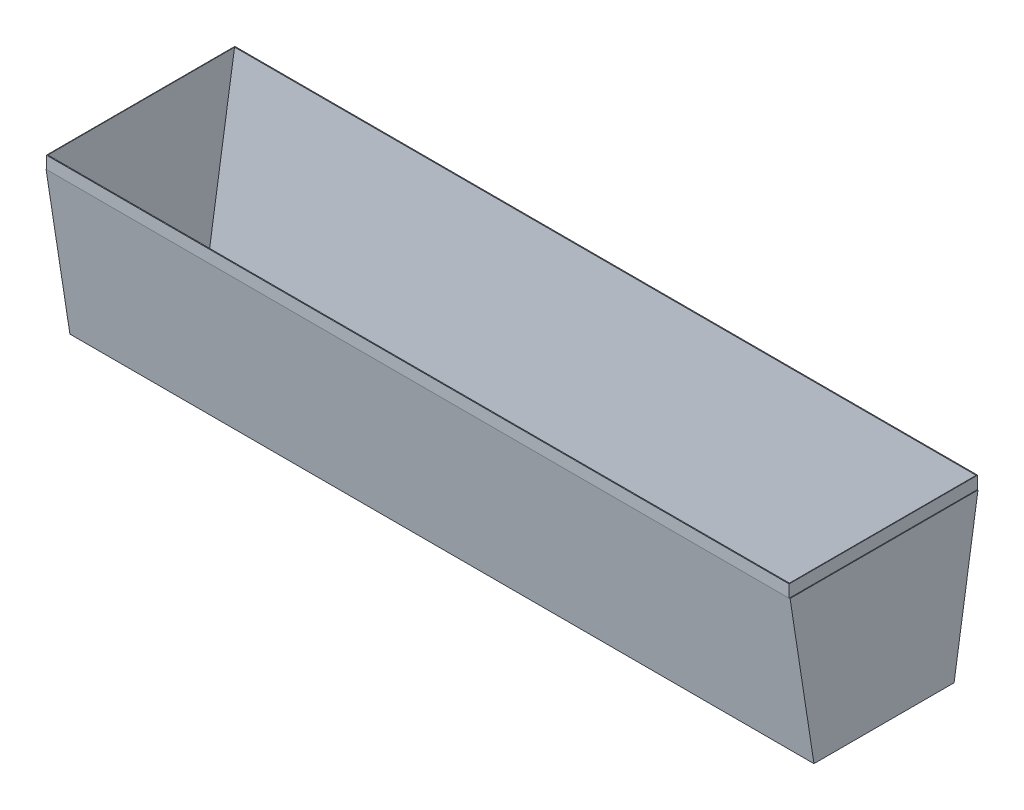
ISO-10303-21;
HEADER;
FILE_DESCRIPTION(('STEP AP214'),'2;1');
FILE_NAME('part.step','',(''),(''),'','','');
FILE_SCHEMA(('AUTOMOTIVE_DESIGN { 1 0 10303 214 1 1 1 1 }'));
ENDSEC;
DATA;
#1=APPLICATION_CONTEXT('core data for automotive mechanical design processes');
#2=APPLICATION_PROTOCOL_DEFINITION('international standard','automotive_design',2000,#1);
#3=PRODUCT_CONTEXT('',#1,'mechanical');
#4=PRODUCT('Part','Part','',(#3));
#5=PRODUCT_RELATED_PRODUCT_CATEGORY('part','',(#4));
#6=PRODUCT_DEFINITION_FORMATION('','',#4);
#7=PRODUCT_DEFINITION_CONTEXT('part definition',#1,'design');
#8=PRODUCT_DEFINITION('design','',#6,#7);
#9=PRODUCT_DEFINITION_SHAPE('','',#8);
#10=(LENGTH_UNIT() NAMED_UNIT(*) SI_UNIT(.MILLI.,.METRE.));
#11=(NAMED_UNIT(*) PLANE_ANGLE_UNIT() SI_UNIT($,.RADIAN.));
#12=(NAMED_UNIT(*) SI_UNIT($,.STERADIAN.) SOLID_ANGLE_UNIT());
#13=UNCERTAINTY_MEASURE_WITH_UNIT(LENGTH_MEASURE(1.E-05),#10,'distance_accuracy_value','');
#14=(GEOMETRIC_REPRESENTATION_CONTEXT(3) GLOBAL_UNCERTAINTY_ASSIGNED_CONTEXT((#13)) GLOBAL_UNIT_ASSIGNED_CONTEXT((#10,
#11,#12)) REPRESENTATION_CONTEXT('',''));
#15=CARTESIAN_POINT('',(0.,0.,0.));
#16=DIRECTION('',(0.,0.,1.));
#17=DIRECTION('',(1.,0.,0.));
#18=AXIS2_PLACEMENT_3D('',#15,#16,#17);
#19=CARTESIAN_POINT('',(0.,135.,0.));
#20=DIRECTION('',(0.,1.,0.));
#21=DIRECTION('',(0.,0.,1.));
#22=AXIS2_PLACEMENT_3D('',#19,#20,#21);
#23=PLANE('',#22);
#24=DIRECTION('',(-1.,0.,0.));
#25=VECTOR('',#24,1.);
#26=CARTESIAN_POINT('',(299.,135.,-131.788872207039));
#27=LINE('',#26,#25);
#28=CARTESIAN_POINT('',(299.,135.,-131.788872207039));
#29=VERTEX_POINT('',#28);
#30=CARTESIAN_POINT('',(-299.,135.,-131.788872207039));
#31=VERTEX_POINT('',#30);
#32=EDGE_CURVE('E204',#29,#31,#27,.T.);
#33=ORIENTED_EDGE('',*,*,#32,.F.);
#34=DIRECTION('',(0.,0.,-1.));
#35=VECTOR('',#34,1.);
#36=CARTESIAN_POINT('',(299.,135.,-131.788872207039));
#37=LINE('',#36,#35);
#38=CARTESIAN_POINT('',(299.,135.,18.788872207039));
#39=VERTEX_POINT('',#38);
#40=EDGE_CURVE('E192',#39,#29,#37,.T.);
#41=ORIENTED_EDGE('',*,*,#40,.F.);
#42=DIRECTION('',(-1.,0.,0.));
#43=VECTOR('',#42,1.);
#44=CARTESIAN_POINT('',(299.,135.,18.788872207039));
#45=LINE('',#44,#43);
#46=CARTESIAN_POINT('',(-299.,135.,18.788872207039));
#47=VERTEX_POINT('',#46);
#48=EDGE_CURVE('E207',#39,#47,#45,.T.);
#49=ORIENTED_EDGE('',*,*,#48,.T.);
#50=DIRECTION('',(0.,0.,-1.));
#51=VECTOR('',#50,1.);
#52=CARTESIAN_POINT('',(-299.,135.,-131.788872207039));
#53=LINE('',#52,#51);
#54=EDGE_CURVE('E186',#47,#31,#53,.T.);
#55=ORIENTED_EDGE('',*,*,#54,.T.);
#56=EDGE_LOOP('',(#33,#41,#49,#55));
#57=FACE_BOUND('',#56,.T.);
#58=DIRECTION('',(-1.,0.,0.));
#59=VECTOR('',#58,1.);
#60=CARTESIAN_POINT('',(-308.45833333,135.,19.4999999966667));
#61=LINE('',#60,#59);
#62=CARTESIAN_POINT('',(299.45833333,135.,19.4999999966667));
#63=VERTEX_POINT('',#62);
#64=CARTESIAN_POINT('',(-299.45833333,135.,19.4999999966667));
#65=VERTEX_POINT('',#64);
#66=EDGE_CURVE('E168',#63,#65,#61,.T.);
#67=ORIENTED_EDGE('',*,*,#66,.F.);
#68=DIRECTION('',(0.,0.,1.));
#69=VECTOR('',#68,1.);
#70=CARTESIAN_POINT('',(299.45833333,135.,19.4999999966667));
#71=LINE('',#70,#69);
#72=CARTESIAN_POINT('',(299.45833333,135.,-132.499999996667));
#73=VERTEX_POINT('',#72);
#74=EDGE_CURVE('E151',#73,#63,#71,.T.);
#75=ORIENTED_EDGE('',*,*,#74,.F.);
#76=DIRECTION('',(1.,0.,0.));
#77=VECTOR('',#76,1.);
#78=CARTESIAN_POINT('',(308.45833333,135.,-132.499999996667));
#79=LINE('',#78,#77);
#80=CARTESIAN_POINT('',(-299.45833333,135.,-132.499999996667));
#81=VERTEX_POINT('',#80);
#82=EDGE_CURVE('E179',#81,#73,#79,.T.);
#83=ORIENTED_EDGE('',*,*,#82,.F.);
#84=DIRECTION('',(0.,0.,-1.));
#85=VECTOR('',#84,1.);
#86=CARTESIAN_POINT('',(-299.45833333,135.,-132.499999996667));
#87=LINE('',#86,#85);
#88=EDGE_CURVE('E274',#65,#81,#87,.T.);
#89=ORIENTED_EDGE('',*,*,#88,.F.);
#90=EDGE_LOOP('',(#67,#75,#83,#89));
#91=FACE_BOUND('',#90,.T.);
#92=ADVANCED_FACE('F39',(#57,#91),#23,.T.);
#93=CARTESIAN_POINT('',(0.,125.,0.));
#94=DIRECTION('',(0.,1.,0.));
#95=DIRECTION('',(0.,0.,1.));
#96=AXIS2_PLACEMENT_3D('',#93,#94,#95);
#97=PLANE('',#96);
#98=DIRECTION('',(0.,0.,-1.));
#99=VECTOR('',#98,1.);
#100=CARTESIAN_POINT('',(299.45833333,125.,19.4999999966667));
#101=LINE('',#100,#99);
#102=CARTESIAN_POINT('',(299.45833333,125.,19.4999999966667));
#103=VERTEX_POINT('',#102);
#104=CARTESIAN_POINT('',(299.45833333,125.,19.2708333333334));
#105=VERTEX_POINT('',#104);
#106=EDGE_CURVE('E148',#103,#105,#101,.T.);
#107=ORIENTED_EDGE('',*,*,#106,.F.);
#108=DIRECTION('',(1.,0.,0.));
#109=VECTOR('',#108,1.);
#110=CARTESIAN_POINT('',(-308.45833333,125.,19.4999999966667));
#111=LINE('',#110,#109);
#112=CARTESIAN_POINT('',(-299.45833333,125.,19.4999999966667));
#113=VERTEX_POINT('',#112);
#114=EDGE_CURVE('E160',#113,#103,#111,.T.);
#115=ORIENTED_EDGE('',*,*,#114,.F.);
#116=DIRECTION('',(0.,0.,1.));
#117=VECTOR('',#116,1.);
#118=CARTESIAN_POINT('',(-299.45833333,125.,-132.499999996667));
#119=LINE('',#118,#117);
#120=CARTESIAN_POINT('',(-299.45833333,125.,19.2708333333334));
#121=VERTEX_POINT('',#120);
#122=EDGE_CURVE('E54',#121,#113,#119,.T.);
#123=ORIENTED_EDGE('',*,*,#122,.F.);
#124=DIRECTION('',(-1.,0.,0.));
#125=VECTOR('',#124,1.);
#126=CARTESIAN_POINT('',(-300.,125.,19.2708333333334));
#127=LINE('',#126,#125);
#128=EDGE_CURVE('E161',#105,#121,#127,.T.);
#129=ORIENTED_EDGE('',*,*,#128,.F.);
#130=EDGE_LOOP('',(#107,#115,#123,#129));
#131=FACE_BOUND('',#130,.T.);
#132=ADVANCED_FACE('F159',(#131),#97,.F.);
#133=CARTESIAN_POINT('',(299.45833333,125.,-132.270833333333));
#134=VERTEX_POINT('',#133);
#135=CARTESIAN_POINT('',(299.45833333,125.,-132.499999996667));
#136=VERTEX_POINT('',#135);
#137=EDGE_CURVE('E155',#134,#136,#101,.T.);
#138=ORIENTED_EDGE('',*,*,#137,.F.);
#139=DIRECTION('',(-1.,0.,0.));
#140=VECTOR('',#139,1.);
#141=CARTESIAN_POINT('',(-300.,125.,-132.270833333333));
#142=LINE('',#141,#140);
#143=CARTESIAN_POINT('',(-299.45833333,125.,-132.270833333333));
#144=VERTEX_POINT('',#143);
#145=EDGE_CURVE('E206',#134,#144,#142,.T.);
#146=ORIENTED_EDGE('',*,*,#145,.T.);
#147=CARTESIAN_POINT('',(-299.45833333,125.,-132.499999996667));
#148=VERTEX_POINT('',#147);
#149=EDGE_CURVE('E264',#148,#144,#119,.T.);
#150=ORIENTED_EDGE('',*,*,#149,.F.);
#151=DIRECTION('',(-1.,0.,0.));
#152=VECTOR('',#151,1.);
#153=CARTESIAN_POINT('',(308.45833333,125.,-132.499999996667));
#154=LINE('',#153,#152);
#155=EDGE_CURVE('E171',#136,#148,#154,.T.);
#156=ORIENTED_EDGE('',*,*,#155,.F.);
#157=EDGE_LOOP('',(#138,#146,#150,#156));
#158=FACE_BOUND('',#157,.T.);
#159=ADVANCED_FACE('F261',(#158),#97,.F.);
#160=CARTESIAN_POINT('',(0.,0.,-132.499999996667));
#161=DIRECTION('',(0.,0.,-1.));
#162=DIRECTION('',(-1.,0.,0.));
#163=AXIS2_PLACEMENT_3D('',#160,#161,#162);
#164=PLANE('',#163);
#165=ORIENTED_EDGE('',*,*,#82,.T.);
#166=DIRECTION('',(0.,1.,0.));
#167=VECTOR('',#166,1.);
#168=CARTESIAN_POINT('',(299.45833333,135.,-132.499999996667));
#169=LINE('',#168,#167);
#170=EDGE_CURVE('E163',#136,#73,#169,.T.);
#171=ORIENTED_EDGE('',*,*,#170,.F.);
#172=ORIENTED_EDGE('',*,*,#155,.T.);
#173=DIRECTION('',(0.,-1.,0.));
#174=VECTOR('',#173,1.);
#175=CARTESIAN_POINT('',(-299.45833333,135.,-132.499999996667));
#176=LINE('',#175,#174);
#177=EDGE_CURVE('E273',#81,#148,#176,.T.);
#178=ORIENTED_EDGE('',*,*,#177,.F.);
#179=EDGE_LOOP('',(#165,#171,#172,#178));
#180=FACE_BOUND('',#179,.T.);
#181=ADVANCED_FACE('F284',(#180),#164,.T.);
#182=CARTESIAN_POINT('',(0.,0.,19.4999999966667));
#183=DIRECTION('',(0.,0.,1.));
#184=DIRECTION('',(1.,0.,0.));
#185=AXIS2_PLACEMENT_3D('',#182,#183,#184);
#186=PLANE('',#185);
#187=ORIENTED_EDGE('',*,*,#114,.T.);
#188=DIRECTION('',(0.,-1.,0.));
#189=VECTOR('',#188,1.);
#190=CARTESIAN_POINT('',(299.45833333,135.,19.4999999966667));
#191=LINE('',#190,#189);
#192=EDGE_CURVE('E144',#63,#103,#191,.T.);
#193=ORIENTED_EDGE('',*,*,#192,.F.);
#194=ORIENTED_EDGE('',*,*,#66,.T.);
#195=DIRECTION('',(0.,1.,0.));
#196=VECTOR('',#195,1.);
#197=CARTESIAN_POINT('',(-299.45833333,135.,19.4999999966667));
#198=LINE('',#197,#196);
#199=EDGE_CURVE('E167',#113,#65,#198,.T.);
#200=ORIENTED_EDGE('',*,*,#199,.F.);
#201=EDGE_LOOP('',(#187,#193,#194,#200));
#202=FACE_BOUND('',#201,.T.);
#203=ADVANCED_FACE('F166',(#202),#186,.T.);
#204=CARTESIAN_POINT('',(-300.,130.,20.0416666666667));
#205=DIRECTION('',(0.,-0.152366623153642,0.988324042077676));
#206=DIRECTION('',(0.,-0.988324042077676,-0.152366623153642));
#207=AXIS2_PLACEMENT_3D('',#204,#205,#206);
#208=PLANE('',#207);
#209=DIRECTION('',(0.,-0.988324042077676,-0.152366623153642));
#210=VECTOR('',#209,1.);
#211=CARTESIAN_POINT('',(300.,130.,20.0416666666667));
#212=LINE('',#211,#210);
#213=CARTESIAN_POINT('',(300.,125.,19.2708333333334));
#214=VERTEX_POINT('',#213);
#215=CARTESIAN_POINT('',(300.,0.,0.));
#216=VERTEX_POINT('',#215);
#217=EDGE_CURVE('E219',#214,#216,#212,.T.);
#218=ORIENTED_EDGE('',*,*,#217,.F.);
#219=EDGE_CURVE('E215',#214,#105,#127,.T.);
#220=ORIENTED_EDGE('',*,*,#219,.T.);
#221=ORIENTED_EDGE('',*,*,#128,.T.);
#222=DIRECTION('',(1.,0.,0.));
#223=VECTOR('',#222,1.);
#224=CARTESIAN_POINT('',(-300.,125.,19.2708333333334));
#225=LINE('',#224,#223);
#226=CARTESIAN_POINT('',(-300.,125.,19.2708333333334));
#227=VERTEX_POINT('',#226);
#228=EDGE_CURVE('E169',#227,#121,#225,.T.);
#229=ORIENTED_EDGE('',*,*,#228,.F.);
#230=DIRECTION('',(0.,-0.988324042077676,-0.152366623153642));
#231=VECTOR('',#230,1.);
#232=CARTESIAN_POINT('',(-300.,130.,20.0416666666667));
#233=LINE('',#232,#231);
#234=CARTESIAN_POINT('',(-300.,0.,0.));
#235=VERTEX_POINT('',#234);
#236=EDGE_CURVE('E220',#227,#235,#233,.T.);
#237=ORIENTED_EDGE('',*,*,#236,.T.);
#238=DIRECTION('',(1.,0.,0.));
#239=VECTOR('',#238,1.);
#240=CARTESIAN_POINT('',(-300.,0.,0.));
#241=LINE('',#240,#239);
#242=EDGE_CURVE('E228',#235,#216,#241,.T.);
#243=ORIENTED_EDGE('',*,*,#242,.T.);
#244=EDGE_LOOP('',(#218,#220,#221,#229,#237,#243));
#245=FACE_BOUND('',#244,.T.);
#246=ADVANCED_FACE('F41',(#245),#208,.T.);
#247=CARTESIAN_POINT('',(-300.,130.,-133.041666666667));
#248=DIRECTION('',(0.,0.152366623153642,0.988324042077676));
#249=DIRECTION('',(0.,-0.988324042077676,0.152366623153642));
#250=AXIS2_PLACEMENT_3D('',#247,#248,#249);
#251=PLANE('',#250);
#252=CARTESIAN_POINT('',(300.,125.,-132.270833333333));
#253=VERTEX_POINT('',#252);
#254=EDGE_CURVE('E213',#253,#134,#142,.T.);
#255=ORIENTED_EDGE('',*,*,#254,.F.);
#256=DIRECTION('',(0.,-0.988324042077676,0.152366623153642));
#257=VECTOR('',#256,1.);
#258=CARTESIAN_POINT('',(300.,130.,-133.041666666667));
#259=LINE('',#258,#257);
#260=CARTESIAN_POINT('',(300.,0.,-113.));
#261=VERTEX_POINT('',#260);
#262=EDGE_CURVE('E223',#253,#261,#259,.T.);
#263=ORIENTED_EDGE('',*,*,#262,.T.);
#264=DIRECTION('',(1.,0.,0.));
#265=VECTOR('',#264,1.);
#266=CARTESIAN_POINT('',(-300.,0.,-113.));
#267=LINE('',#266,#265);
#268=CARTESIAN_POINT('',(-300.,0.,-113.));
#269=VERTEX_POINT('',#268);
#270=EDGE_CURVE('E47',#269,#261,#267,.T.);
#271=ORIENTED_EDGE('',*,*,#270,.F.);
#272=DIRECTION('',(0.,-0.988324042077676,0.152366623153642));
#273=VECTOR('',#272,1.);
#274=CARTESIAN_POINT('',(-300.,130.,-133.041666666667));
#275=LINE('',#274,#273);
#276=CARTESIAN_POINT('',(-300.,125.,-132.270833333333));
#277=VERTEX_POINT('',#276);
#278=EDGE_CURVE('E226',#277,#269,#275,.T.);
#279=ORIENTED_EDGE('',*,*,#278,.F.);
#280=DIRECTION('',(1.,0.,0.));
#281=VECTOR('',#280,1.);
#282=CARTESIAN_POINT('',(-300.,125.,-132.270833333333));
#283=LINE('',#282,#281);
#284=EDGE_CURVE('E174',#277,#144,#283,.T.);
#285=ORIENTED_EDGE('',*,*,#284,.T.);
#286=ORIENTED_EDGE('',*,*,#145,.F.);
#287=EDGE_LOOP('',(#255,#263,#271,#279,#285,#286));
#288=FACE_BOUND('',#287,.T.);
#289=ADVANCED_FACE('F254',(#288),#251,.F.);
#290=CARTESIAN_POINT('',(-300.,0.,0.));
#291=DIRECTION('',(1.,0.,0.));
#292=DIRECTION('',(0.,0.,-1.));
#293=AXIS2_PLACEMENT_3D('',#290,#291,#292);
#294=PLANE('',#293);
#295=DIRECTION('',(0.,0.,1.));
#296=VECTOR('',#295,1.);
#297=CARTESIAN_POINT('',(-300.,125.,0.));
#298=LINE('',#297,#296);
#299=EDGE_CURVE('E217',#277,#227,#298,.T.);
#300=ORIENTED_EDGE('',*,*,#299,.F.);
#301=ORIENTED_EDGE('',*,*,#278,.T.);
#302=DIRECTION('',(0.,0.,-1.));
#303=VECTOR('',#302,1.);
#304=CARTESIAN_POINT('',(-300.,0.,0.));
#305=LINE('',#304,#303);
#306=EDGE_CURVE('E222',#235,#269,#305,.T.);
#307=ORIENTED_EDGE('',*,*,#306,.F.);
#308=ORIENTED_EDGE('',*,*,#236,.F.);
#309=EDGE_LOOP('',(#300,#301,#307,#308));
#310=FACE_BOUND('',#309,.T.);
#311=ADVANCED_FACE('F306',(#310),#294,.F.);
#312=CARTESIAN_POINT('',(300.,0.,0.));
#313=DIRECTION('',(1.,0.,0.));
#314=DIRECTION('',(0.,0.,-1.));
#315=AXIS2_PLACEMENT_3D('',#312,#313,#314);
#316=PLANE('',#315);
#317=ORIENTED_EDGE('',*,*,#262,.F.);
#318=DIRECTION('',(0.,0.,1.));
#319=VECTOR('',#318,1.);
#320=CARTESIAN_POINT('',(300.,125.,0.));
#321=LINE('',#320,#319);
#322=EDGE_CURVE('E11',#253,#214,#321,.T.);
#323=ORIENTED_EDGE('',*,*,#322,.T.);
#324=ORIENTED_EDGE('',*,*,#217,.T.);
#325=DIRECTION('',(0.,0.,-1.));
#326=VECTOR('',#325,1.);
#327=CARTESIAN_POINT('',(300.,0.,0.));
#328=LINE('',#327,#326);
#329=EDGE_CURVE('E230',#216,#261,#328,.T.);
#330=ORIENTED_EDGE('',*,*,#329,.T.);
#331=EDGE_LOOP('',(#317,#323,#324,#330));
#332=FACE_BOUND('',#331,.T.);
#333=ADVANCED_FACE('F248',(#332),#316,.T.);
#334=CARTESIAN_POINT('',(-300.,0.,0.));
#335=DIRECTION('',(0.,-1.,0.));
#336=DIRECTION('',(0.,0.,-1.));
#337=AXIS2_PLACEMENT_3D('',#334,#335,#336);
#338=PLANE('',#337);
#339=ORIENTED_EDGE('',*,*,#329,.F.);
#340=ORIENTED_EDGE('',*,*,#242,.F.);
#341=ORIENTED_EDGE('',*,*,#306,.T.);
#342=ORIENTED_EDGE('',*,*,#270,.T.);
#343=EDGE_LOOP('',(#339,#340,#341,#342));
#344=FACE_BOUND('',#343,.T.);
#345=ADVANCED_FACE('F244',(#344),#338,.T.);
#346=CARTESIAN_POINT('',(299.,135.,-131.788872207039));
#347=DIRECTION('',(0.,-0.152366623153642,-0.988324042077676));
#348=DIRECTION('',(0.,0.988324042077676,-0.152366623153642));
#349=AXIS2_PLACEMENT_3D('',#346,#347,#348);
#350=PLANE('',#349);
#351=DIRECTION('',(0.,-0.988324042077676,0.152366623153642));
#352=VECTOR('',#351,1.);
#353=CARTESIAN_POINT('',(-299.,135.,-131.788872207039));
#354=LINE('',#353,#352);
#355=CARTESIAN_POINT('',(-299.,2.,-111.284705540372));
#356=VERTEX_POINT('',#355);
#357=EDGE_CURVE('E62',#31,#356,#354,.T.);
#358=ORIENTED_EDGE('',*,*,#357,.T.);
#359=DIRECTION('',(-1.,0.,0.));
#360=VECTOR('',#359,1.);
#361=CARTESIAN_POINT('',(299.,2.,-111.284705540372));
#362=LINE('',#361,#360);
#363=CARTESIAN_POINT('',(299.,2.,-111.284705540372));
#364=VERTEX_POINT('',#363);
#365=EDGE_CURVE('E195',#364,#356,#362,.T.);
#366=ORIENTED_EDGE('',*,*,#365,.F.);
#367=DIRECTION('',(0.,-0.988324042077676,0.152366623153642));
#368=VECTOR('',#367,1.);
#369=CARTESIAN_POINT('',(299.,135.,-131.788872207039));
#370=LINE('',#369,#368);
#371=EDGE_CURVE('E182',#29,#364,#370,.T.);
#372=ORIENTED_EDGE('',*,*,#371,.F.);
#373=ORIENTED_EDGE('',*,*,#32,.T.);
#374=EDGE_LOOP('',(#358,#366,#372,#373));
#375=FACE_BOUND('',#374,.T.);
#376=ADVANCED_FACE('F303',(#375),#350,.F.);
#377=CARTESIAN_POINT('',(299.,1.99999999999998,-1.71529445962773));
#378=DIRECTION('',(0.,-0.152366623153642,0.988324042077676));
#379=DIRECTION('',(0.,-0.988324042077676,-0.152366623153642));
#380=AXIS2_PLACEMENT_3D('',#377,#378,#379);
#381=PLANE('',#380);
#382=DIRECTION('',(0.,0.988324042077676,0.152366623153642));
#383=VECTOR('',#382,1.);
#384=CARTESIAN_POINT('',(-299.,1.99999999999998,-1.71529445962773));
#385=LINE('',#384,#383);
#386=CARTESIAN_POINT('',(-299.,1.99999999999998,-1.71529445962773));
#387=VERTEX_POINT('',#386);
#388=EDGE_CURVE('E200',#387,#47,#385,.T.);
#389=ORIENTED_EDGE('',*,*,#388,.T.);
#390=ORIENTED_EDGE('',*,*,#48,.F.);
#391=DIRECTION('',(0.,0.988324042077676,0.152366623153642));
#392=VECTOR('',#391,1.);
#393=CARTESIAN_POINT('',(299.,1.99999999999998,-1.71529445962773));
#394=LINE('',#393,#392);
#395=CARTESIAN_POINT('',(299.,1.99999999999998,-1.71529445962773));
#396=VERTEX_POINT('',#395);
#397=EDGE_CURVE('E189',#396,#39,#394,.T.);
#398=ORIENTED_EDGE('',*,*,#397,.F.);
#399=DIRECTION('',(-1.,0.,0.));
#400=VECTOR('',#399,1.);
#401=CARTESIAN_POINT('',(299.,1.99999999999998,-1.71529445962773));
#402=LINE('',#401,#400);
#403=EDGE_CURVE('E210',#396,#387,#402,.T.);
#404=ORIENTED_EDGE('',*,*,#403,.T.);
#405=EDGE_LOOP('',(#389,#390,#398,#404));
#406=FACE_BOUND('',#405,.T.);
#407=ADVANCED_FACE('F317',(#406),#381,.F.);
#408=CARTESIAN_POINT('',(299.,2.,-111.284705540372));
#409=DIRECTION('',(0.,-1.,0.));
#410=DIRECTION('',(0.,0.,-1.));
#411=AXIS2_PLACEMENT_3D('',#408,#409,#410);
#412=PLANE('',#411);
#413=DIRECTION('',(0.,0.,1.));
#414=VECTOR('',#413,1.);
#415=CARTESIAN_POINT('',(-299.,2.,-111.284705540372));
#416=LINE('',#415,#414);
#417=EDGE_CURVE('E197',#356,#387,#416,.T.);
#418=ORIENTED_EDGE('',*,*,#417,.T.);
#419=ORIENTED_EDGE('',*,*,#403,.F.);
#420=DIRECTION('',(0.,0.,1.));
#421=VECTOR('',#420,1.);
#422=CARTESIAN_POINT('',(299.,2.,-111.284705540372));
#423=LINE('',#422,#421);
#424=EDGE_CURVE('E185',#364,#396,#423,.T.);
#425=ORIENTED_EDGE('',*,*,#424,.F.);
#426=ORIENTED_EDGE('',*,*,#365,.T.);
#427=EDGE_LOOP('',(#418,#419,#425,#426));
#428=FACE_BOUND('',#427,.T.);
#429=ADVANCED_FACE('F322',(#428),#412,.F.);
#430=CARTESIAN_POINT('',(299.,0.,0.));
#431=DIRECTION('',(-1.,0.,0.));
#432=DIRECTION('',(0.,0.,1.));
#433=AXIS2_PLACEMENT_3D('',#430,#431,#432);
#434=PLANE('',#433);
#435=ORIENTED_EDGE('',*,*,#371,.T.);
#436=ORIENTED_EDGE('',*,*,#424,.T.);
#437=ORIENTED_EDGE('',*,*,#397,.T.);
#438=ORIENTED_EDGE('',*,*,#40,.T.);
#439=EDGE_LOOP('',(#435,#436,#437,#438));
#440=FACE_BOUND('',#439,.T.);
#441=ADVANCED_FACE('F332',(#440),#434,.T.);
#442=CARTESIAN_POINT('',(-299.,0.,0.));
#443=DIRECTION('',(-1.,0.,0.));
#444=DIRECTION('',(0.,0.,1.));
#445=AXIS2_PLACEMENT_3D('',#442,#443,#444);
#446=PLANE('',#445);
#447=ORIENTED_EDGE('',*,*,#357,.F.);
#448=ORIENTED_EDGE('',*,*,#54,.F.);
#449=ORIENTED_EDGE('',*,*,#388,.F.);
#450=ORIENTED_EDGE('',*,*,#417,.F.);
#451=EDGE_LOOP('',(#447,#448,#449,#450));
#452=FACE_BOUND('',#451,.T.);
#453=ADVANCED_FACE('F328',(#452),#446,.F.);
#454=CARTESIAN_POINT('',(-299.45833333,125.,-132.499999996667));
#455=DIRECTION('',(0.,-1.,0.));
#456=DIRECTION('',(0.,0.,-1.));
#457=AXIS2_PLACEMENT_3D('',#454,#455,#456);
#458=PLANE('',#457);
#459=ORIENTED_EDGE('',*,*,#228,.T.);
#460=EDGE_CURVE('E266',#144,#121,#119,.T.);
#461=ORIENTED_EDGE('',*,*,#460,.F.);
#462=ORIENTED_EDGE('',*,*,#284,.F.);
#463=ORIENTED_EDGE('',*,*,#299,.T.);
#464=EDGE_LOOP('',(#459,#461,#462,#463));
#465=FACE_BOUND('',#464,.T.);
#466=ADVANCED_FACE('F267',(#465),#458,.F.);
#467=CARTESIAN_POINT('',(-299.45833333,0.,0.));
#468=DIRECTION('',(-1.,0.,0.));
#469=DIRECTION('',(0.,0.,1.));
#470=AXIS2_PLACEMENT_3D('',#467,#468,#469);
#471=PLANE('',#470);
#472=ORIENTED_EDGE('',*,*,#177,.T.);
#473=ORIENTED_EDGE('',*,*,#149,.T.);
#474=ORIENTED_EDGE('',*,*,#460,.T.);
#475=ORIENTED_EDGE('',*,*,#122,.T.);
#476=ORIENTED_EDGE('',*,*,#199,.T.);
#477=ORIENTED_EDGE('',*,*,#88,.T.);
#478=EDGE_LOOP('',(#472,#473,#474,#475,#476,#477));
#479=FACE_BOUND('',#478,.T.);
#480=ADVANCED_FACE('F271',(#479),#471,.T.);
#481=CARTESIAN_POINT('',(299.45833333,125.,19.4999999966667));
#482=DIRECTION('',(0.,-1.,0.));
#483=DIRECTION('',(0.,0.,-1.));
#484=AXIS2_PLACEMENT_3D('',#481,#482,#483);
#485=PLANE('',#484);
#486=ORIENTED_EDGE('',*,*,#219,.F.);
#487=ORIENTED_EDGE('',*,*,#322,.F.);
#488=ORIENTED_EDGE('',*,*,#254,.T.);
#489=EDGE_CURVE('E164',#105,#134,#101,.T.);
#490=ORIENTED_EDGE('',*,*,#489,.F.);
#491=EDGE_LOOP('',(#486,#487,#488,#490));
#492=FACE_BOUND('',#491,.T.);
#493=ADVANCED_FACE('F251',(#492),#485,.F.);
#494=CARTESIAN_POINT('',(299.45833333,0.,0.));
#495=DIRECTION('',(1.,0.,0.));
#496=DIRECTION('',(0.,0.,-1.));
#497=AXIS2_PLACEMENT_3D('',#494,#495,#496);
#498=PLANE('',#497);
#499=ORIENTED_EDGE('',*,*,#192,.T.);
#500=ORIENTED_EDGE('',*,*,#106,.T.);
#501=ORIENTED_EDGE('',*,*,#489,.T.);
#502=ORIENTED_EDGE('',*,*,#137,.T.);
#503=ORIENTED_EDGE('',*,*,#170,.T.);
#504=ORIENTED_EDGE('',*,*,#74,.T.);
#505=EDGE_LOOP('',(#499,#500,#501,#502,#503,#504));
#506=FACE_BOUND('',#505,.T.);
#507=ADVANCED_FACE('F146',(#506),#498,.T.);
#508=CLOSED_SHELL('',(#92,#132,#159,#181,#203,#246,#289,#311,#333,#345,#376,#407,#429,#441,#453,
#466,#480,#493,#507));
#509=MANIFOLD_SOLID_BREP('B2',#508);
#510=ADVANCED_BREP_SHAPE_REPRESENTATION('',(#18,#509),#14);
#511=SHAPE_DEFINITION_REPRESENTATION(#9,#510);
ENDSEC;
END-ISO-10303-21;
